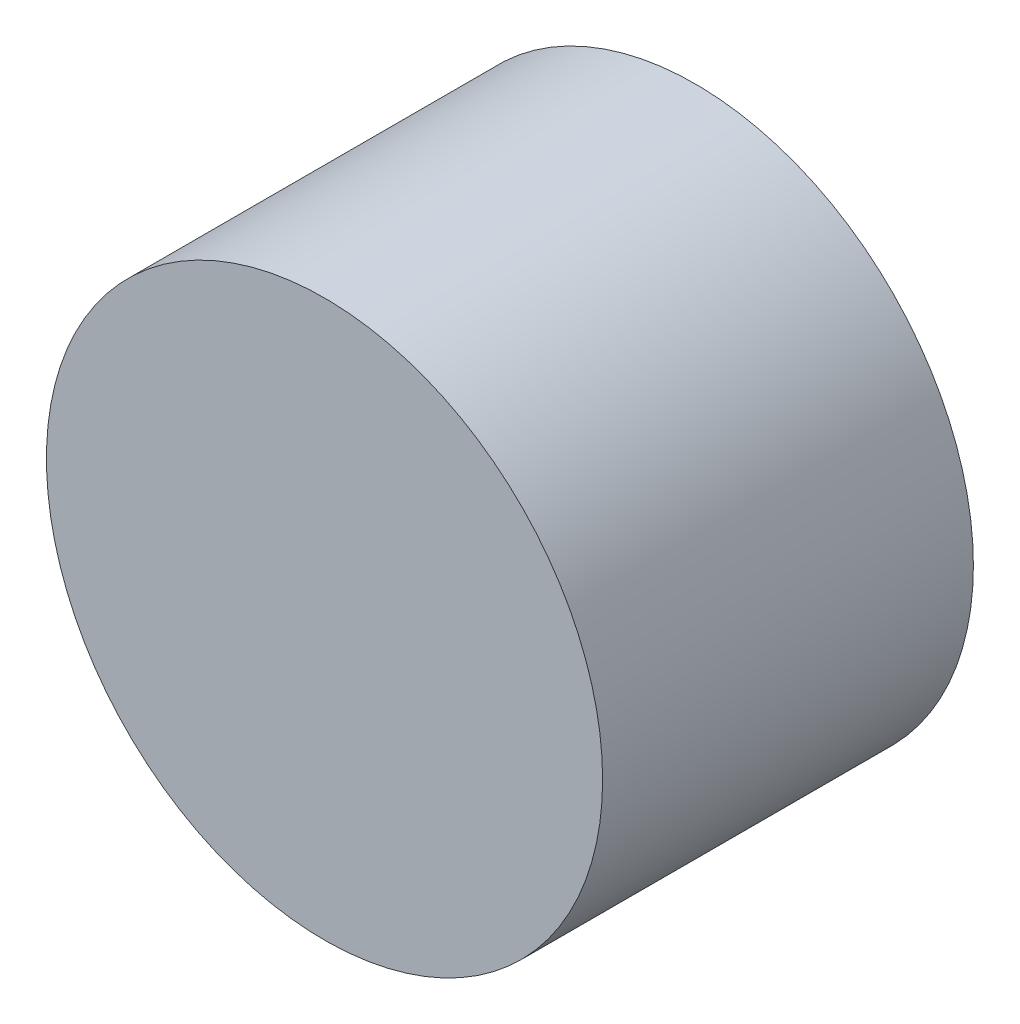
ISO-10303-21;
HEADER;
FILE_DESCRIPTION(('STEP AP214'),'2;1');
FILE_NAME('part.step','',(''),(''),'','','');
FILE_SCHEMA(('AUTOMOTIVE_DESIGN { 1 0 10303 214 1 1 1 1 }'));
ENDSEC;
DATA;
#1=APPLICATION_CONTEXT('core data for automotive mechanical design processes');
#2=APPLICATION_PROTOCOL_DEFINITION('international standard','automotive_design',2000,#1);
#3=PRODUCT_CONTEXT('',#1,'mechanical');
#4=PRODUCT('Part','Part','',(#3));
#5=PRODUCT_RELATED_PRODUCT_CATEGORY('part','',(#4));
#6=PRODUCT_DEFINITION_FORMATION('','',#4);
#7=PRODUCT_DEFINITION_CONTEXT('part definition',#1,'design');
#8=PRODUCT_DEFINITION('design','',#6,#7);
#9=PRODUCT_DEFINITION_SHAPE('','',#8);
#10=(LENGTH_UNIT() NAMED_UNIT(*) SI_UNIT(.MILLI.,.METRE.));
#11=(NAMED_UNIT(*) PLANE_ANGLE_UNIT() SI_UNIT($,.RADIAN.));
#12=(NAMED_UNIT(*) SI_UNIT($,.STERADIAN.) SOLID_ANGLE_UNIT());
#13=UNCERTAINTY_MEASURE_WITH_UNIT(LENGTH_MEASURE(1.E-05),#10,'distance_accuracy_value','');
#14=(GEOMETRIC_REPRESENTATION_CONTEXT(3) GLOBAL_UNCERTAINTY_ASSIGNED_CONTEXT((#13)) GLOBAL_UNIT_ASSIGNED_CONTEXT((#10,
#11,#12)) REPRESENTATION_CONTEXT('',''));
#15=CARTESIAN_POINT('',(0.,0.,0.));
#16=DIRECTION('',(0.,0.,1.));
#17=DIRECTION('',(1.,0.,0.));
#18=AXIS2_PLACEMENT_3D('',#15,#16,#17);
#19=CARTESIAN_POINT('',(0.,0.,24.));
#20=DIRECTION('',(0.,0.,-1.));
#21=DIRECTION('',(-1.,0.,0.));
#22=AXIS2_PLACEMENT_3D('',#19,#20,#21);
#23=CYLINDRICAL_SURFACE('',#22,18.);
#24=CARTESIAN_POINT('',(0.,0.,24.));
#25=DIRECTION('',(0.,0.,1.));
#26=DIRECTION('',(1.,0.,0.));
#27=AXIS2_PLACEMENT_3D('',#24,#25,#26);
#28=CIRCLE('',#27,18.);
#29=CARTESIAN_POINT('',(18.,0.,24.));
#30=VERTEX_POINT('',#29);
#31=EDGE_CURVE('E10',#30,#30,#28,.T.);
#32=ORIENTED_EDGE('',*,*,#31,.F.);
#33=EDGE_LOOP('',(#32));
#34=FACE_BOUND('',#33,.T.);
#35=CARTESIAN_POINT('',(0.,0.,0.));
#36=DIRECTION('',(0.,0.,1.));
#37=DIRECTION('',(1.,0.,0.));
#38=AXIS2_PLACEMENT_3D('',#35,#36,#37);
#39=CIRCLE('',#38,18.);
#40=CARTESIAN_POINT('',(18.,0.,0.));
#41=VERTEX_POINT('',#40);
#42=EDGE_CURVE('E45',#41,#41,#39,.T.);
#43=ORIENTED_EDGE('',*,*,#42,.T.);
#44=EDGE_LOOP('',(#43));
#45=FACE_BOUND('',#44,.T.);
#46=ADVANCED_FACE('F39',(#34,#45),#23,.T.);
#47=CARTESIAN_POINT('',(0.,0.,24.));
#48=DIRECTION('',(0.,0.,1.));
#49=DIRECTION('',(1.,0.,0.));
#50=AXIS2_PLACEMENT_3D('',#47,#48,#49);
#51=PLANE('',#50);
#52=ORIENTED_EDGE('',*,*,#31,.T.);
#53=EDGE_LOOP('',(#52));
#54=FACE_BOUND('',#53,.T.);
#55=ADVANCED_FACE('F53',(#54),#51,.T.);
#56=CARTESIAN_POINT('',(0.,0.,0.));
#57=DIRECTION('',(0.,0.,1.));
#58=DIRECTION('',(1.,0.,0.));
#59=AXIS2_PLACEMENT_3D('',#56,#57,#58);
#60=PLANE('',#59);
#61=ORIENTED_EDGE('',*,*,#42,.F.);
#62=EDGE_LOOP('',(#61));
#63=FACE_BOUND('',#62,.T.);
#64=ADVANCED_FACE('F55',(#63),#60,.F.);
#65=CLOSED_SHELL('',(#46,#55,#64));
#66=MANIFOLD_SOLID_BREP('B2',#65);
#67=ADVANCED_BREP_SHAPE_REPRESENTATION('',(#18,#66),#14);
#68=SHAPE_DEFINITION_REPRESENTATION(#9,#67);
ENDSEC;
END-ISO-10303-21;
